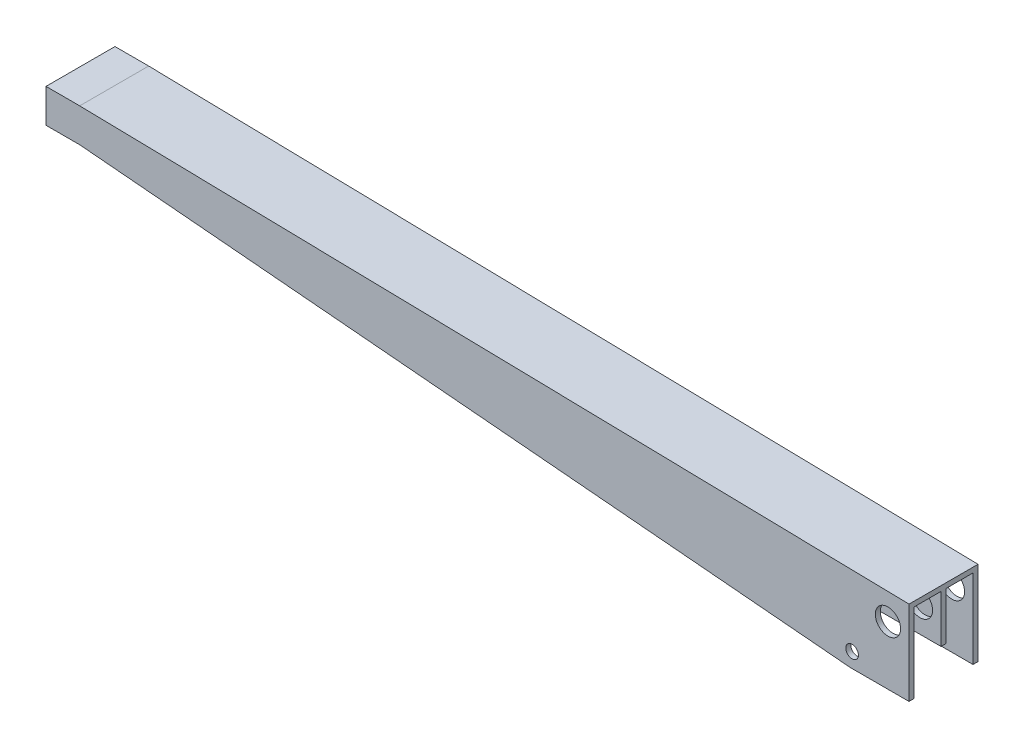
ISO-10303-21;
HEADER;
FILE_DESCRIPTION(('STEP AP214'),'2;1');
FILE_NAME('part.step','',(''),(''),'','','');
FILE_SCHEMA(('AUTOMOTIVE_DESIGN { 1 0 10303 214 1 1 1 1 }'));
ENDSEC;
DATA;
#1=APPLICATION_CONTEXT('core data for automotive mechanical design processes');
#2=APPLICATION_PROTOCOL_DEFINITION('international standard','automotive_design',2000,#1);
#3=PRODUCT_CONTEXT('',#1,'mechanical');
#4=PRODUCT('Part','Part','',(#3));
#5=PRODUCT_RELATED_PRODUCT_CATEGORY('part','',(#4));
#6=PRODUCT_DEFINITION_FORMATION('','',#4);
#7=PRODUCT_DEFINITION_CONTEXT('part definition',#1,'design');
#8=PRODUCT_DEFINITION('design','',#6,#7);
#9=PRODUCT_DEFINITION_SHAPE('','',#8);
#10=(LENGTH_UNIT() NAMED_UNIT(*) SI_UNIT(.MILLI.,.METRE.));
#11=(NAMED_UNIT(*) PLANE_ANGLE_UNIT() SI_UNIT($,.RADIAN.));
#12=(NAMED_UNIT(*) SI_UNIT($,.STERADIAN.) SOLID_ANGLE_UNIT());
#13=UNCERTAINTY_MEASURE_WITH_UNIT(LENGTH_MEASURE(1.E-05),#10,'distance_accuracy_value','');
#14=(GEOMETRIC_REPRESENTATION_CONTEXT(3) GLOBAL_UNCERTAINTY_ASSIGNED_CONTEXT((#13)) GLOBAL_UNIT_ASSIGNED_CONTEXT((#10,
#11,#12)) REPRESENTATION_CONTEXT('',''));
#15=CARTESIAN_POINT('',(0.,0.,0.));
#16=DIRECTION('',(0.,0.,1.));
#17=DIRECTION('',(1.,0.,0.));
#18=AXIS2_PLACEMENT_3D('',#15,#16,#17);
#19=CARTESIAN_POINT('',(-15.,239.301894781674,-2600.83256824123));
#20=DIRECTION('',(-0.0203288112779674,-0.999793348363563,0.));
#21=DIRECTION('',(0.999793348363563,-0.0203288112779674,0.));
#22=AXIS2_PLACEMENT_3D('',#19,#20,#21);
#23=PLANE('',#22);
#24=DIRECTION('',(0.,0.,1.));
#25=VECTOR('',#24,1.);
#26=CARTESIAN_POINT('',(0.,238.996899584748,-2600.83256824123));
#27=LINE('',#26,#25);
#28=CARTESIAN_POINT('',(0.,238.996899584748,0.));
#29=VERTEX_POINT('',#28);
#30=CARTESIAN_POINT('',(0.,238.996899584748,81.3999999999999));
#31=VERTEX_POINT('',#30);
#32=EDGE_CURVE('E270',#29,#31,#27,.T.);
#33=ORIENTED_EDGE('',*,*,#32,.T.);
#34=DIRECTION('',(-0.999793348363563,0.0203288112779674,0.));
#35=VECTOR('',#34,1.);
#36=CARTESIAN_POINT('',(-15.,239.301894781674,81.3999999999999));
#37=LINE('',#36,#35);
#38=CARTESIAN_POINT('',(-2498.5524818399,289.8,81.3999999999999));
#39=VERTEX_POINT('',#38);
#40=EDGE_CURVE('E228',#31,#39,#37,.T.);
#41=ORIENTED_EDGE('',*,*,#40,.T.);
#42=DIRECTION('',(0.,0.,1.));
#43=VECTOR('',#42,1.);
#44=CARTESIAN_POINT('',(-2498.5524818399,289.8,-2600.83256824123));
#45=LINE('',#44,#43);
#46=CARTESIAN_POINT('',(-2498.5524818399,289.8,0.));
#47=VERTEX_POINT('',#46);
#48=EDGE_CURVE('E288',#47,#39,#45,.T.);
#49=ORIENTED_EDGE('',*,*,#48,.F.);
#50=DIRECTION('',(-0.999793348363563,0.0203288112779674,0.));
#51=VECTOR('',#50,1.);
#52=CARTESIAN_POINT('',(-15.,239.301894781674,0.));
#53=LINE('',#52,#51);
#54=EDGE_CURVE('E269',#29,#47,#53,.T.);
#55=ORIENTED_EDGE('',*,*,#54,.F.);
#56=EDGE_LOOP('',(#33,#41,#49,#55));
#57=FACE_BOUND('',#56,.T.);
#58=ADVANCED_FACE('F36',(#57),#23,.T.);
#59=CARTESIAN_POINT('',(-2498.5524818399,289.8,-2600.83256824123));
#60=DIRECTION('',(0.,-1.,0.));
#61=DIRECTION('',(1.,0.,0.));
#62=AXIS2_PLACEMENT_3D('',#59,#60,#61);
#63=PLANE('',#62);
#64=ORIENTED_EDGE('',*,*,#48,.T.);
#65=DIRECTION('',(-1.,0.,0.));
#66=VECTOR('',#65,1.);
#67=CARTESIAN_POINT('',(-2498.5524818399,289.8,81.3999999999999));
#68=LINE('',#67,#66);
#69=CARTESIAN_POINT('',(-2600.,289.8,81.3999999999999));
#70=VERTEX_POINT('',#69);
#71=EDGE_CURVE('E226',#39,#70,#68,.T.);
#72=ORIENTED_EDGE('',*,*,#71,.T.);
#73=DIRECTION('',(0.,0.,1.));
#74=VECTOR('',#73,1.);
#75=CARTESIAN_POINT('',(-2600.,289.8,-2600.83256824123));
#76=LINE('',#75,#74);
#77=CARTESIAN_POINT('',(-2600.,289.8,0.));
#78=VERTEX_POINT('',#77);
#79=EDGE_CURVE('E292',#78,#70,#76,.T.);
#80=ORIENTED_EDGE('',*,*,#79,.F.);
#81=DIRECTION('',(-1.,0.,0.));
#82=VECTOR('',#81,1.);
#83=CARTESIAN_POINT('',(-2498.5524818399,289.8,0.));
#84=LINE('',#83,#82);
#85=EDGE_CURVE('E266',#47,#78,#84,.T.);
#86=ORIENTED_EDGE('',*,*,#85,.F.);
#87=EDGE_LOOP('',(#64,#72,#80,#86));
#88=FACE_BOUND('',#87,.T.);
#89=ADVANCED_FACE('F355',(#88),#63,.T.);
#90=DIRECTION('',(-0.999793348363563,0.0203288112779674,0.));
#91=VECTOR('',#90,1.);
#92=CARTESIAN_POINT('',(-15.,239.301894781674,96.4));
#93=LINE('',#92,#91);
#94=CARTESIAN_POINT('',(0.,238.996899584748,96.4));
#95=VERTEX_POINT('',#94);
#96=CARTESIAN_POINT('',(-2498.5524818399,289.8,96.4));
#97=VERTEX_POINT('',#96);
#98=EDGE_CURVE('E223',#95,#97,#93,.T.);
#99=ORIENTED_EDGE('',*,*,#98,.F.);
#100=CARTESIAN_POINT('',(0.,238.996899584748,177.8));
#101=VERTEX_POINT('',#100);
#102=EDGE_CURVE('E287',#95,#101,#27,.T.);
#103=ORIENTED_EDGE('',*,*,#102,.T.);
#104=DIRECTION('',(-0.999793348363563,0.0203288112779674,0.));
#105=VECTOR('',#104,1.);
#106=CARTESIAN_POINT('',(-15.,239.301894781674,177.8));
#107=LINE('',#106,#105);
#108=CARTESIAN_POINT('',(-2498.5524818399,289.8,177.8));
#109=VERTEX_POINT('',#108);
#110=EDGE_CURVE('E262',#101,#109,#107,.T.);
#111=ORIENTED_EDGE('',*,*,#110,.T.);
#112=EDGE_CURVE('E291',#97,#109,#45,.T.);
#113=ORIENTED_EDGE('',*,*,#112,.F.);
#114=EDGE_LOOP('',(#99,#103,#111,#113));
#115=FACE_BOUND('',#114,.T.);
#116=ADVANCED_FACE('F410',(#115),#23,.T.);
#117=DIRECTION('',(-1.,0.,0.));
#118=VECTOR('',#117,1.);
#119=CARTESIAN_POINT('',(-2498.5524818399,289.8,96.4));
#120=LINE('',#119,#118);
#121=CARTESIAN_POINT('',(-2600.,289.8,96.4));
#122=VERTEX_POINT('',#121);
#123=EDGE_CURVE('E60',#97,#122,#120,.T.);
#124=ORIENTED_EDGE('',*,*,#123,.F.);
#125=ORIENTED_EDGE('',*,*,#112,.T.);
#126=DIRECTION('',(-1.,0.,0.));
#127=VECTOR('',#126,1.);
#128=CARTESIAN_POINT('',(-2498.5524818399,289.8,177.8));
#129=LINE('',#128,#127);
#130=CARTESIAN_POINT('',(-2600.,289.8,177.8));
#131=VERTEX_POINT('',#130);
#132=EDGE_CURVE('E11',#109,#131,#129,.T.);
#133=ORIENTED_EDGE('',*,*,#132,.T.);
#134=EDGE_CURVE('E284',#122,#131,#76,.T.);
#135=ORIENTED_EDGE('',*,*,#134,.F.);
#136=EDGE_LOOP('',(#124,#125,#133,#135));
#137=FACE_BOUND('',#136,.T.);
#138=ADVANCED_FACE('F402',(#137),#63,.T.);
#139=CARTESIAN_POINT('',(0.,0.,0.));
#140=DIRECTION('',(0.,0.,1.));
#141=DIRECTION('',(1.,0.,0.));
#142=AXIS2_PLACEMENT_3D('',#139,#140,#141);
#143=PLANE('',#142);
#144=CARTESIAN_POINT('',(-171.45,44.45,0.));
#145=DIRECTION('',(0.,0.,1.));
#146=DIRECTION('',(1.,0.,0.));
#147=AXIS2_PLACEMENT_3D('',#144,#145,#146);
#148=CIRCLE('',#147,19.05);
#149=CARTESIAN_POINT('',(-152.4,44.45,0.));
#150=VERTEX_POINT('',#149);
#151=EDGE_CURVE('E381',#150,#150,#148,.T.);
#152=ORIENTED_EDGE('',*,*,#151,.F.);
#153=EDGE_LOOP('',(#152));
#154=FACE_BOUND('',#153,.T.);
#155=CARTESIAN_POINT('',(-63.5,176.782795881907,0.));
#156=DIRECTION('',(0.,0.,1.));
#157=DIRECTION('',(1.,0.,0.));
#158=AXIS2_PLACEMENT_3D('',#155,#156,#157);
#159=CIRCLE('',#158,38.1);
#160=CARTESIAN_POINT('',(-25.4,176.782795881907,0.));
#161=VERTEX_POINT('',#160);
#162=EDGE_CURVE('E204',#161,#161,#159,.T.);
#163=ORIENTED_EDGE('',*,*,#162,.F.);
#164=EDGE_LOOP('',(#163));
#165=FACE_BOUND('',#164,.T.);
#166=DIRECTION('',(0.,1.,0.));
#167=VECTOR('',#166,1.);
#168=CARTESIAN_POINT('',(0.,0.,0.));
#169=LINE('',#168,#167);
#170=CARTESIAN_POINT('',(0.,0.,0.));
#171=VERTEX_POINT('',#170);
#172=EDGE_CURVE('E299',#171,#29,#169,.T.);
#173=ORIENTED_EDGE('',*,*,#172,.T.);
#174=ORIENTED_EDGE('',*,*,#54,.T.);
#175=ORIENTED_EDGE('',*,*,#85,.T.);
#176=DIRECTION('',(0.,-1.,0.));
#177=VECTOR('',#176,1.);
#178=CARTESIAN_POINT('',(-2600.,304.8,0.));
#179=LINE('',#178,#177);
#180=CARTESIAN_POINT('',(-2600.,203.2,0.));
#181=VERTEX_POINT('',#180);
#182=EDGE_CURVE('E273',#78,#181,#179,.T.);
#183=ORIENTED_EDGE('',*,*,#182,.T.);
#184=DIRECTION('',(1.,0.,0.));
#185=VECTOR('',#184,1.);
#186=CARTESIAN_POINT('',(-2600.,203.2,0.));
#187=LINE('',#186,#185);
#188=CARTESIAN_POINT('',(-2498.4,203.2,0.));
#189=VERTEX_POINT('',#188);
#190=EDGE_CURVE('E319',#181,#189,#187,.T.);
#191=ORIENTED_EDGE('',*,*,#190,.T.);
#192=DIRECTION('',(0.996188217209835,-0.0872297878725495,0.));
#193=VECTOR('',#192,1.);
#194=CARTESIAN_POINT('',(-2498.4,203.2,0.));
#195=LINE('',#194,#193);
#196=CARTESIAN_POINT('',(-177.8,0.,0.));
#197=VERTEX_POINT('',#196);
#198=EDGE_CURVE('E322',#189,#197,#195,.T.);
#199=ORIENTED_EDGE('',*,*,#198,.T.);
#200=DIRECTION('',(1.,0.,0.));
#201=VECTOR('',#200,1.);
#202=CARTESIAN_POINT('',(-177.8,0.,0.));
#203=LINE('',#202,#201);
#204=EDGE_CURVE('E325',#197,#171,#203,.T.);
#205=ORIENTED_EDGE('',*,*,#204,.T.);
#206=EDGE_LOOP('',(#173,#174,#175,#183,#191,#199,#205));
#207=FACE_BOUND('',#206,.T.);
#208=ADVANCED_FACE('F352',(#154,#165,#207),#143,.T.);
#209=CARTESIAN_POINT('',(-2600.,304.8,-15.));
#210=DIRECTION('',(-1.,0.,0.));
#211=DIRECTION('',(0.,0.,1.));
#212=AXIS2_PLACEMENT_3D('',#209,#210,#211);
#213=PLANE('',#212);
#214=DIRECTION('',(0.,-1.,0.));
#215=VECTOR('',#214,1.);
#216=CARTESIAN_POINT('',(-2600.,289.8,192.8));
#217=LINE('',#216,#215);
#218=CARTESIAN_POINT('',(-2600.,304.8,192.8));
#219=VERTEX_POINT('',#218);
#220=CARTESIAN_POINT('',(-2600.,203.2,192.8));
#221=VERTEX_POINT('',#220);
#222=EDGE_CURVE('E276',#219,#221,#217,.T.);
#223=ORIENTED_EDGE('',*,*,#222,.F.);
#224=DIRECTION('',(0.,0.,1.));
#225=VECTOR('',#224,1.);
#226=CARTESIAN_POINT('',(-2600.,304.8,-15.));
#227=LINE('',#226,#225);
#228=CARTESIAN_POINT('',(-2600.,304.8,-15.));
#229=VERTEX_POINT('',#228);
#230=EDGE_CURVE('E45',#229,#219,#227,.T.);
#231=ORIENTED_EDGE('',*,*,#230,.F.);
#232=DIRECTION('',(0.,-1.,0.));
#233=VECTOR('',#232,1.);
#234=CARTESIAN_POINT('',(-2600.,304.8,-15.));
#235=LINE('',#234,#233);
#236=CARTESIAN_POINT('',(-2600.,203.2,-15.));
#237=VERTEX_POINT('',#236);
#238=EDGE_CURVE('E295',#229,#237,#235,.T.);
#239=ORIENTED_EDGE('',*,*,#238,.T.);
#240=DIRECTION('',(0.,0.,1.));
#241=VECTOR('',#240,1.);
#242=CARTESIAN_POINT('',(-2600.,203.2,-15.));
#243=LINE('',#242,#241);
#244=EDGE_CURVE('E317',#237,#181,#243,.T.);
#245=ORIENTED_EDGE('',*,*,#244,.T.);
#246=ORIENTED_EDGE('',*,*,#182,.F.);
#247=ORIENTED_EDGE('',*,*,#79,.T.);
#248=DIRECTION('',(0.,-1.,0.));
#249=VECTOR('',#248,1.);
#250=CARTESIAN_POINT('',(-2600.,304.8,81.4));
#251=LINE('',#250,#249);
#252=CARTESIAN_POINT('',(-2600.,203.2,81.4));
#253=VERTEX_POINT('',#252);
#254=EDGE_CURVE('E215',#70,#253,#251,.T.);
#255=ORIENTED_EDGE('',*,*,#254,.T.);
#256=DIRECTION('',(0.,0.,1.));
#257=VECTOR('',#256,1.);
#258=CARTESIAN_POINT('',(-2600.,203.2,81.4));
#259=LINE('',#258,#257);
#260=CARTESIAN_POINT('',(-2600.,203.2,96.4));
#261=VERTEX_POINT('',#260);
#262=EDGE_CURVE('E218',#253,#261,#259,.T.);
#263=ORIENTED_EDGE('',*,*,#262,.T.);
#264=DIRECTION('',(0.,-1.,0.));
#265=VECTOR('',#264,1.);
#266=CARTESIAN_POINT('',(-2600.,304.8,96.4));
#267=LINE('',#266,#265);
#268=EDGE_CURVE('E202',#122,#261,#267,.T.);
#269=ORIENTED_EDGE('',*,*,#268,.F.);
#270=ORIENTED_EDGE('',*,*,#134,.T.);
#271=DIRECTION('',(0.,-1.,0.));
#272=VECTOR('',#271,1.);
#273=CARTESIAN_POINT('',(-2600.,304.8,177.8));
#274=LINE('',#273,#272);
#275=CARTESIAN_POINT('',(-2600.,203.2,177.8));
#276=VERTEX_POINT('',#275);
#277=EDGE_CURVE('E235',#131,#276,#274,.T.);
#278=ORIENTED_EDGE('',*,*,#277,.T.);
#279=DIRECTION('',(0.,0.,-1.));
#280=VECTOR('',#279,1.);
#281=CARTESIAN_POINT('',(-2600.,203.2,192.8));
#282=LINE('',#281,#280);
#283=EDGE_CURVE('E240',#221,#276,#282,.T.);
#284=ORIENTED_EDGE('',*,*,#283,.F.);
#285=EDGE_LOOP('',(#223,#231,#239,#245,#246,#247,#255,#263,#269,#270,#278,#284));
#286=FACE_BOUND('',#285,.T.);
#287=ADVANCED_FACE('F38',(#286),#213,.T.);
#288=CARTESIAN_POINT('',(-2600.,304.8,-15.));
#289=DIRECTION('',(0.,1.,0.));
#290=DIRECTION('',(-1.,0.,0.));
#291=AXIS2_PLACEMENT_3D('',#288,#289,#290);
#292=PLANE('',#291);
#293=DIRECTION('',(-1.,0.,0.));
#294=VECTOR('',#293,1.);
#295=CARTESIAN_POINT('',(-2600.,304.8,192.8));
#296=LINE('',#295,#294);
#297=CARTESIAN_POINT('',(-2498.4,304.8,192.8));
#298=VERTEX_POINT('',#297);
#299=EDGE_CURVE('E265',#298,#219,#296,.T.);
#300=ORIENTED_EDGE('',*,*,#299,.F.);
#301=DIRECTION('',(0.,0.,1.));
#302=VECTOR('',#301,1.);
#303=CARTESIAN_POINT('',(-2498.4,304.8,-15.));
#304=LINE('',#303,#302);
#305=CARTESIAN_POINT('',(-2498.4,304.8,-15.));
#306=VERTEX_POINT('',#305);
#307=EDGE_CURVE('E331',#306,#298,#304,.T.);
#308=ORIENTED_EDGE('',*,*,#307,.F.);
#309=DIRECTION('',(-1.,0.,0.));
#310=VECTOR('',#309,1.);
#311=CARTESIAN_POINT('',(-2600.,304.8,-15.));
#312=LINE('',#311,#310);
#313=EDGE_CURVE('E314',#306,#229,#312,.T.);
#314=ORIENTED_EDGE('',*,*,#313,.T.);
#315=ORIENTED_EDGE('',*,*,#230,.T.);
#316=EDGE_LOOP('',(#300,#308,#314,#315));
#317=FACE_BOUND('',#316,.T.);
#318=ADVANCED_FACE('F409',(#317),#292,.T.);
#319=CARTESIAN_POINT('',(0.,254.,-15.));
#320=DIRECTION('',(0.0203288112779655,0.999793348363563,0.));
#321=DIRECTION('',(-0.999793348363563,0.0203288112779655,0.));
#322=AXIS2_PLACEMENT_3D('',#319,#320,#321);
#323=PLANE('',#322);
#324=DIRECTION('',(-0.999793348363563,0.0203288112779655,0.));
#325=VECTOR('',#324,1.);
#326=CARTESIAN_POINT('',(-2498.4,304.8,192.8));
#327=LINE('',#326,#325);
#328=CARTESIAN_POINT('',(0.,254.,192.8));
#329=VERTEX_POINT('',#328);
#330=EDGE_CURVE('E281',#329,#298,#327,.T.);
#331=ORIENTED_EDGE('',*,*,#330,.F.);
#332=DIRECTION('',(0.,0.,1.));
#333=VECTOR('',#332,1.);
#334=CARTESIAN_POINT('',(0.,254.,-15.));
#335=LINE('',#334,#333);
#336=CARTESIAN_POINT('',(0.,254.,-15.));
#337=VERTEX_POINT('',#336);
#338=EDGE_CURVE('E333',#337,#329,#335,.T.);
#339=ORIENTED_EDGE('',*,*,#338,.F.);
#340=DIRECTION('',(-0.999793348363563,0.0203288112779655,0.));
#341=VECTOR('',#340,1.);
#342=CARTESIAN_POINT('',(0.,254.,-15.));
#343=LINE('',#342,#341);
#344=EDGE_CURVE('E311',#337,#306,#343,.T.);
#345=ORIENTED_EDGE('',*,*,#344,.T.);
#346=ORIENTED_EDGE('',*,*,#307,.T.);
#347=EDGE_LOOP('',(#331,#339,#345,#346));
#348=FACE_BOUND('',#347,.T.);
#349=ADVANCED_FACE('F458',(#348),#323,.T.);
#350=CARTESIAN_POINT('',(0.,0.,-15.));
#351=DIRECTION('',(1.,0.,0.));
#352=DIRECTION('',(0.,0.,-1.));
#353=AXIS2_PLACEMENT_3D('',#350,#351,#352);
#354=PLANE('',#353);
#355=DIRECTION('',(0.,0.,1.));
#356=VECTOR('',#355,1.);
#357=CARTESIAN_POINT('',(0.,95.25,-1187.76053470456));
#358=LINE('',#357,#356);
#359=CARTESIAN_POINT('',(0.,95.25,81.3999999999999));
#360=VERTEX_POINT('',#359);
#361=CARTESIAN_POINT('',(0.,95.25,96.4));
#362=VERTEX_POINT('',#361);
#363=EDGE_CURVE('E52',#360,#362,#358,.T.);
#364=ORIENTED_EDGE('',*,*,#363,.F.);
#365=DIRECTION('',(0.,1.,0.));
#366=VECTOR('',#365,1.);
#367=CARTESIAN_POINT('',(0.,0.,81.4));
#368=LINE('',#367,#366);
#369=EDGE_CURVE('E213',#360,#31,#368,.T.);
#370=ORIENTED_EDGE('',*,*,#369,.T.);
#371=ORIENTED_EDGE('',*,*,#32,.F.);
#372=ORIENTED_EDGE('',*,*,#172,.F.);
#373=DIRECTION('',(0.,0.,1.));
#374=VECTOR('',#373,1.);
#375=CARTESIAN_POINT('',(0.,0.,-15.));
#376=LINE('',#375,#374);
#377=CARTESIAN_POINT('',(0.,0.,-15.));
#378=VERTEX_POINT('',#377);
#379=EDGE_CURVE('E335',#378,#171,#376,.T.);
#380=ORIENTED_EDGE('',*,*,#379,.F.);
#381=DIRECTION('',(0.,1.,0.));
#382=VECTOR('',#381,1.);
#383=CARTESIAN_POINT('',(0.,0.,-15.));
#384=LINE('',#383,#382);
#385=EDGE_CURVE('E308',#378,#337,#384,.T.);
#386=ORIENTED_EDGE('',*,*,#385,.T.);
#387=ORIENTED_EDGE('',*,*,#338,.T.);
#388=DIRECTION('',(0.,1.,0.));
#389=VECTOR('',#388,1.);
#390=CARTESIAN_POINT('',(0.,238.996899584748,192.8));
#391=LINE('',#390,#389);
#392=CARTESIAN_POINT('',(0.,0.,192.8));
#393=VERTEX_POINT('',#392);
#394=EDGE_CURVE('E278',#393,#329,#391,.T.);
#395=ORIENTED_EDGE('',*,*,#394,.F.);
#396=DIRECTION('',(0.,0.,-1.));
#397=VECTOR('',#396,1.);
#398=CARTESIAN_POINT('',(0.,0.,192.8));
#399=LINE('',#398,#397);
#400=CARTESIAN_POINT('',(0.,0.,177.8));
#401=VERTEX_POINT('',#400);
#402=EDGE_CURVE('E253',#393,#401,#399,.T.);
#403=ORIENTED_EDGE('',*,*,#402,.T.);
#404=DIRECTION('',(0.,1.,0.));
#405=VECTOR('',#404,1.);
#406=CARTESIAN_POINT('',(0.,0.,177.8));
#407=LINE('',#406,#405);
#408=EDGE_CURVE('E247',#401,#101,#407,.T.);
#409=ORIENTED_EDGE('',*,*,#408,.T.);
#410=ORIENTED_EDGE('',*,*,#102,.F.);
#411=DIRECTION('',(0.,1.,0.));
#412=VECTOR('',#411,1.);
#413=CARTESIAN_POINT('',(0.,0.,96.4));
#414=LINE('',#413,#412);
#415=EDGE_CURVE('E200',#362,#95,#414,.T.);
#416=ORIENTED_EDGE('',*,*,#415,.F.);
#417=EDGE_LOOP('',(#364,#370,#371,#372,#380,#386,#387,#395,#403,#409,#410,#416));
#418=FACE_BOUND('',#417,.T.);
#419=ADVANCED_FACE('F429',(#418),#354,.T.);
#420=CARTESIAN_POINT('',(-177.8,0.,-15.));
#421=DIRECTION('',(0.,-1.,0.));
#422=DIRECTION('',(0.,0.,-1.));
#423=AXIS2_PLACEMENT_3D('',#420,#421,#422);
#424=PLANE('',#423);
#425=ORIENTED_EDGE('',*,*,#204,.F.);
#426=DIRECTION('',(0.,0.,1.));
#427=VECTOR('',#426,1.);
#428=CARTESIAN_POINT('',(-177.8,0.,-15.));
#429=LINE('',#428,#427);
#430=CARTESIAN_POINT('',(-177.8,0.,-15.));
#431=VERTEX_POINT('',#430);
#432=EDGE_CURVE('E337',#431,#197,#429,.T.);
#433=ORIENTED_EDGE('',*,*,#432,.F.);
#434=DIRECTION('',(1.,0.,0.));
#435=VECTOR('',#434,1.);
#436=CARTESIAN_POINT('',(-177.8,0.,-15.));
#437=LINE('',#436,#435);
#438=EDGE_CURVE('E305',#431,#378,#437,.T.);
#439=ORIENTED_EDGE('',*,*,#438,.T.);
#440=ORIENTED_EDGE('',*,*,#379,.T.);
#441=EDGE_LOOP('',(#425,#433,#439,#440));
#442=FACE_BOUND('',#441,.T.);
#443=ADVANCED_FACE('F464',(#442),#424,.T.);
#444=CARTESIAN_POINT('',(-2498.4,203.2,-15.));
#445=DIRECTION('',(-0.0872297878725495,-0.996188217209835,0.));
#446=DIRECTION('',(0.996188217209835,-0.0872297878725495,0.));
#447=AXIS2_PLACEMENT_3D('',#444,#445,#446);
#448=PLANE('',#447);
#449=ORIENTED_EDGE('',*,*,#198,.F.);
#450=DIRECTION('',(0.,0.,1.));
#451=VECTOR('',#450,1.);
#452=CARTESIAN_POINT('',(-2498.4,203.2,-15.));
#453=LINE('',#452,#451);
#454=CARTESIAN_POINT('',(-2498.4,203.2,-15.));
#455=VERTEX_POINT('',#454);
#456=EDGE_CURVE('E339',#455,#189,#453,.T.);
#457=ORIENTED_EDGE('',*,*,#456,.F.);
#458=DIRECTION('',(0.996188217209835,-0.0872297878725495,0.));
#459=VECTOR('',#458,1.);
#460=CARTESIAN_POINT('',(-2498.4,203.2,-15.));
#461=LINE('',#460,#459);
#462=EDGE_CURVE('E302',#455,#431,#461,.T.);
#463=ORIENTED_EDGE('',*,*,#462,.T.);
#464=ORIENTED_EDGE('',*,*,#432,.T.);
#465=EDGE_LOOP('',(#449,#457,#463,#464));
#466=FACE_BOUND('',#465,.T.);
#467=ADVANCED_FACE('F466',(#466),#448,.T.);
#468=CARTESIAN_POINT('',(-2600.,203.2,-15.));
#469=DIRECTION('',(0.,-1.,0.));
#470=DIRECTION('',(0.,0.,-1.));
#471=AXIS2_PLACEMENT_3D('',#468,#469,#470);
#472=PLANE('',#471);
#473=ORIENTED_EDGE('',*,*,#190,.F.);
#474=ORIENTED_EDGE('',*,*,#244,.F.);
#475=DIRECTION('',(1.,0.,0.));
#476=VECTOR('',#475,1.);
#477=CARTESIAN_POINT('',(-2600.,203.2,-15.));
#478=LINE('',#477,#476);
#479=EDGE_CURVE('E298',#237,#455,#478,.T.);
#480=ORIENTED_EDGE('',*,*,#479,.T.);
#481=ORIENTED_EDGE('',*,*,#456,.T.);
#482=EDGE_LOOP('',(#473,#474,#480,#481));
#483=FACE_BOUND('',#482,.T.);
#484=ADVANCED_FACE('F349',(#483),#472,.T.);
#485=CARTESIAN_POINT('',(0.,0.,-15.));
#486=DIRECTION('',(0.,0.,1.));
#487=DIRECTION('',(1.,0.,0.));
#488=AXIS2_PLACEMENT_3D('',#485,#486,#487);
#489=PLANE('',#488);
#490=CARTESIAN_POINT('',(-171.45,44.45,-15.));
#491=DIRECTION('',(0.,0.,1.));
#492=DIRECTION('',(1.,0.,0.));
#493=AXIS2_PLACEMENT_3D('',#490,#491,#492);
#494=CIRCLE('',#493,19.05);
#495=CARTESIAN_POINT('',(-152.4,44.45,-15.));
#496=VERTEX_POINT('',#495);
#497=EDGE_CURVE('E372',#496,#496,#494,.T.);
#498=ORIENTED_EDGE('',*,*,#497,.T.);
#499=EDGE_LOOP('',(#498));
#500=FACE_BOUND('',#499,.T.);
#501=CARTESIAN_POINT('',(-63.5,176.782795881907,-15.));
#502=DIRECTION('',(0.,0.,1.));
#503=DIRECTION('',(1.,0.,0.));
#504=AXIS2_PLACEMENT_3D('',#501,#502,#503);
#505=CIRCLE('',#504,38.1);
#506=CARTESIAN_POINT('',(-25.4,176.782795881907,-15.));
#507=VERTEX_POINT('',#506);
#508=EDGE_CURVE('E385',#507,#507,#505,.T.);
#509=ORIENTED_EDGE('',*,*,#508,.T.);
#510=EDGE_LOOP('',(#509));
#511=FACE_BOUND('',#510,.T.);
#512=ORIENTED_EDGE('',*,*,#238,.F.);
#513=ORIENTED_EDGE('',*,*,#313,.F.);
#514=ORIENTED_EDGE('',*,*,#344,.F.);
#515=ORIENTED_EDGE('',*,*,#385,.F.);
#516=ORIENTED_EDGE('',*,*,#438,.F.);
#517=ORIENTED_EDGE('',*,*,#462,.F.);
#518=ORIENTED_EDGE('',*,*,#479,.F.);
#519=EDGE_LOOP('',(#512,#513,#514,#515,#516,#517,#518));
#520=FACE_BOUND('',#519,.T.);
#521=ADVANCED_FACE('F453',(#500,#511,#520),#489,.F.);
#522=CARTESIAN_POINT('',(0.,0.,192.8));
#523=DIRECTION('',(0.,0.,1.));
#524=DIRECTION('',(1.,0.,0.));
#525=AXIS2_PLACEMENT_3D('',#522,#523,#524);
#526=PLANE('',#525);
#527=CARTESIAN_POINT('',(-171.45,44.45,192.8));
#528=DIRECTION('',(0.,0.,1.));
#529=DIRECTION('',(1.,0.,0.));
#530=AXIS2_PLACEMENT_3D('',#527,#528,#529);
#531=CIRCLE('',#530,19.05);
#532=CARTESIAN_POINT('',(-152.4,44.45,192.8));
#533=VERTEX_POINT('',#532);
#534=EDGE_CURVE('E369',#533,#533,#531,.T.);
#535=ORIENTED_EDGE('',*,*,#534,.F.);
#536=EDGE_LOOP('',(#535));
#537=FACE_BOUND('',#536,.T.);
#538=CARTESIAN_POINT('',(-63.5,176.782795881907,192.8));
#539=DIRECTION('',(0.,0.,1.));
#540=DIRECTION('',(1.,0.,0.));
#541=AXIS2_PLACEMENT_3D('',#538,#539,#540);
#542=CIRCLE('',#541,38.1);
#543=CARTESIAN_POINT('',(-25.4,176.782795881907,192.8));
#544=VERTEX_POINT('',#543);
#545=EDGE_CURVE('E384',#544,#544,#542,.T.);
#546=ORIENTED_EDGE('',*,*,#545,.F.);
#547=EDGE_LOOP('',(#546));
#548=FACE_BOUND('',#547,.T.);
#549=DIRECTION('',(1.,0.,0.));
#550=VECTOR('',#549,1.);
#551=CARTESIAN_POINT('',(-177.8,0.,192.8));
#552=LINE('',#551,#550);
#553=CARTESIAN_POINT('',(-177.8,0.,192.8));
#554=VERTEX_POINT('',#553);
#555=EDGE_CURVE('E237',#554,#393,#552,.T.);
#556=ORIENTED_EDGE('',*,*,#555,.T.);
#557=ORIENTED_EDGE('',*,*,#394,.T.);
#558=ORIENTED_EDGE('',*,*,#330,.T.);
#559=ORIENTED_EDGE('',*,*,#299,.T.);
#560=ORIENTED_EDGE('',*,*,#222,.T.);
#561=DIRECTION('',(1.,0.,0.));
#562=VECTOR('',#561,1.);
#563=CARTESIAN_POINT('',(-2600.,203.2,192.8));
#564=LINE('',#563,#562);
#565=CARTESIAN_POINT('',(-2498.4,203.2,192.8));
#566=VERTEX_POINT('',#565);
#567=EDGE_CURVE('E231',#221,#566,#564,.T.);
#568=ORIENTED_EDGE('',*,*,#567,.T.);
#569=DIRECTION('',(0.996188217209835,-0.0872297878725495,0.));
#570=VECTOR('',#569,1.);
#571=CARTESIAN_POINT('',(-2498.4,203.2,192.8));
#572=LINE('',#571,#570);
#573=EDGE_CURVE('E234',#566,#554,#572,.T.);
#574=ORIENTED_EDGE('',*,*,#573,.T.);
#575=EDGE_LOOP('',(#556,#557,#558,#559,#560,#568,#574));
#576=FACE_BOUND('',#575,.T.);
#577=ADVANCED_FACE('F448',(#537,#548,#576),#526,.T.);
#578=CARTESIAN_POINT('',(-2600.,203.2,192.8));
#579=DIRECTION('',(0.,1.,0.));
#580=DIRECTION('',(0.,0.,1.));
#581=AXIS2_PLACEMENT_3D('',#578,#579,#580);
#582=PLANE('',#581);
#583=DIRECTION('',(1.,0.,0.));
#584=VECTOR('',#583,1.);
#585=CARTESIAN_POINT('',(-2600.,203.2,177.8));
#586=LINE('',#585,#584);
#587=CARTESIAN_POINT('',(-2498.4,203.2,177.8));
#588=VERTEX_POINT('',#587);
#589=EDGE_CURVE('E230',#276,#588,#586,.T.);
#590=ORIENTED_EDGE('',*,*,#589,.T.);
#591=DIRECTION('',(0.,0.,-1.));
#592=VECTOR('',#591,1.);
#593=CARTESIAN_POINT('',(-2498.4,203.2,192.8));
#594=LINE('',#593,#592);
#595=EDGE_CURVE('E259',#566,#588,#594,.T.);
#596=ORIENTED_EDGE('',*,*,#595,.F.);
#597=ORIENTED_EDGE('',*,*,#567,.F.);
#598=ORIENTED_EDGE('',*,*,#283,.T.);
#599=EDGE_LOOP('',(#590,#596,#597,#598));
#600=FACE_BOUND('',#599,.T.);
#601=ADVANCED_FACE('F441',(#600),#582,.F.);
#602=CARTESIAN_POINT('',(-2498.4,203.2,192.8));
#603=DIRECTION('',(0.0872297878725495,0.996188217209835,0.));
#604=DIRECTION('',(-0.996188217209835,0.0872297878725495,0.));
#605=AXIS2_PLACEMENT_3D('',#602,#603,#604);
#606=PLANE('',#605);
#607=DIRECTION('',(0.996188217209835,-0.0872297878725495,0.));
#608=VECTOR('',#607,1.);
#609=CARTESIAN_POINT('',(-2498.4,203.2,177.8));
#610=LINE('',#609,#608);
#611=CARTESIAN_POINT('',(-177.8,0.,177.8));
#612=VERTEX_POINT('',#611);
#613=EDGE_CURVE('E243',#588,#612,#610,.T.);
#614=ORIENTED_EDGE('',*,*,#613,.T.);
#615=DIRECTION('',(0.,0.,-1.));
#616=VECTOR('',#615,1.);
#617=CARTESIAN_POINT('',(-177.8,0.,192.8));
#618=LINE('',#617,#616);
#619=EDGE_CURVE('E256',#554,#612,#618,.T.);
#620=ORIENTED_EDGE('',*,*,#619,.F.);
#621=ORIENTED_EDGE('',*,*,#573,.F.);
#622=ORIENTED_EDGE('',*,*,#595,.T.);
#623=EDGE_LOOP('',(#614,#620,#621,#622));
#624=FACE_BOUND('',#623,.T.);
#625=ADVANCED_FACE('F445',(#624),#606,.F.);
#626=CARTESIAN_POINT('',(-177.8,0.,192.8));
#627=DIRECTION('',(0.,1.,0.));
#628=DIRECTION('',(0.,0.,1.));
#629=AXIS2_PLACEMENT_3D('',#626,#627,#628);
#630=PLANE('',#629);
#631=DIRECTION('',(1.,0.,0.));
#632=VECTOR('',#631,1.);
#633=CARTESIAN_POINT('',(-177.8,0.,177.8));
#634=LINE('',#633,#632);
#635=EDGE_CURVE('E245',#612,#401,#634,.T.);
#636=ORIENTED_EDGE('',*,*,#635,.T.);
#637=ORIENTED_EDGE('',*,*,#402,.F.);
#638=ORIENTED_EDGE('',*,*,#555,.F.);
#639=ORIENTED_EDGE('',*,*,#619,.T.);
#640=EDGE_LOOP('',(#636,#637,#638,#639));
#641=FACE_BOUND('',#640,.T.);
#642=ADVANCED_FACE('F530',(#641),#630,.F.);
#643=CARTESIAN_POINT('',(0.,0.,177.8));
#644=DIRECTION('',(0.,0.,1.));
#645=DIRECTION('',(1.,0.,0.));
#646=AXIS2_PLACEMENT_3D('',#643,#644,#645);
#647=PLANE('',#646);
#648=CARTESIAN_POINT('',(-171.45,44.45,177.8));
#649=DIRECTION('',(0.,0.,1.));
#650=DIRECTION('',(1.,0.,0.));
#651=AXIS2_PLACEMENT_3D('',#648,#649,#650);
#652=CIRCLE('',#651,19.05);
#653=CARTESIAN_POINT('',(-152.4,44.45,177.8));
#654=VERTEX_POINT('',#653);
#655=EDGE_CURVE('E377',#654,#654,#652,.T.);
#656=ORIENTED_EDGE('',*,*,#655,.T.);
#657=EDGE_LOOP('',(#656));
#658=FACE_BOUND('',#657,.T.);
#659=CARTESIAN_POINT('',(-63.5,176.782795881907,177.8));
#660=DIRECTION('',(0.,0.,1.));
#661=DIRECTION('',(1.,0.,0.));
#662=AXIS2_PLACEMENT_3D('',#659,#660,#661);
#663=CIRCLE('',#662,38.1);
#664=CARTESIAN_POINT('',(-25.4,176.782795881907,177.8));
#665=VERTEX_POINT('',#664);
#666=EDGE_CURVE('E393',#665,#665,#663,.T.);
#667=ORIENTED_EDGE('',*,*,#666,.T.);
#668=EDGE_LOOP('',(#667));
#669=FACE_BOUND('',#668,.T.);
#670=ORIENTED_EDGE('',*,*,#110,.F.);
#671=ORIENTED_EDGE('',*,*,#408,.F.);
#672=ORIENTED_EDGE('',*,*,#635,.F.);
#673=ORIENTED_EDGE('',*,*,#613,.F.);
#674=ORIENTED_EDGE('',*,*,#589,.F.);
#675=ORIENTED_EDGE('',*,*,#277,.F.);
#676=ORIENTED_EDGE('',*,*,#132,.F.);
#677=EDGE_LOOP('',(#670,#671,#672,#673,#674,#675,#676));
#678=FACE_BOUND('',#677,.T.);
#679=ADVANCED_FACE('F434',(#658,#669,#678),#647,.F.);
#680=CARTESIAN_POINT('',(-2600.,203.2,81.4));
#681=DIRECTION('',(0.,-1.,0.));
#682=DIRECTION('',(0.,0.,-1.));
#683=AXIS2_PLACEMENT_3D('',#680,#681,#682);
#684=PLANE('',#683);
#685=DIRECTION('',(0.,0.,1.));
#686=VECTOR('',#685,1.);
#687=CARTESIAN_POINT('',(-2498.4,203.2,81.4));
#688=LINE('',#687,#686);
#689=CARTESIAN_POINT('',(-2498.4,203.2,81.4));
#690=VERTEX_POINT('',#689);
#691=CARTESIAN_POINT('',(-2498.4,203.2,96.4));
#692=VERTEX_POINT('',#691);
#693=EDGE_CURVE('E217',#690,#692,#688,.T.);
#694=ORIENTED_EDGE('',*,*,#693,.T.);
#695=DIRECTION('',(1.,0.,0.));
#696=VECTOR('',#695,1.);
#697=CARTESIAN_POINT('',(-2600.,203.2,96.4));
#698=LINE('',#697,#696);
#699=EDGE_CURVE('E199',#261,#692,#698,.T.);
#700=ORIENTED_EDGE('',*,*,#699,.F.);
#701=ORIENTED_EDGE('',*,*,#262,.F.);
#702=DIRECTION('',(1.,0.,0.));
#703=VECTOR('',#702,1.);
#704=CARTESIAN_POINT('',(-2600.,203.2,81.4));
#705=LINE('',#704,#703);
#706=EDGE_CURVE('E209',#253,#690,#705,.T.);
#707=ORIENTED_EDGE('',*,*,#706,.T.);
#708=EDGE_LOOP('',(#694,#700,#701,#707));
#709=FACE_BOUND('',#708,.T.);
#710=ADVANCED_FACE('F368',(#709),#684,.T.);
#711=CARTESIAN_POINT('',(-2498.4,203.2,81.4));
#712=DIRECTION('',(-0.0872297878725495,-0.996188217209835,0.));
#713=DIRECTION('',(0.996188217209835,-0.0872297878725495,0.));
#714=AXIS2_PLACEMENT_3D('',#711,#712,#713);
#715=PLANE('',#714);
#716=DIRECTION('',(0.,0.,1.));
#717=VECTOR('',#716,1.);
#718=CARTESIAN_POINT('',(-1265.58125,95.25,-1187.76053470456));
#719=LINE('',#718,#717);
#720=CARTESIAN_POINT('',(-1265.58125,95.25,81.3999999999999));
#721=VERTEX_POINT('',#720);
#722=CARTESIAN_POINT('',(-1265.58125,95.25,96.4));
#723=VERTEX_POINT('',#722);
#724=EDGE_CURVE('E180',#721,#723,#719,.T.);
#725=ORIENTED_EDGE('',*,*,#724,.T.);
#726=DIRECTION('',(0.996188217209835,-0.0872297878725495,0.));
#727=VECTOR('',#726,1.);
#728=CARTESIAN_POINT('',(-2498.4,203.2,96.4));
#729=LINE('',#728,#727);
#730=EDGE_CURVE('E190',#692,#723,#729,.T.);
#731=ORIENTED_EDGE('',*,*,#730,.F.);
#732=ORIENTED_EDGE('',*,*,#693,.F.);
#733=DIRECTION('',(0.996188217209835,-0.0872297878725495,0.));
#734=VECTOR('',#733,1.);
#735=CARTESIAN_POINT('',(-2498.4,203.2,81.4));
#736=LINE('',#735,#734);
#737=EDGE_CURVE('E193',#690,#721,#736,.T.);
#738=ORIENTED_EDGE('',*,*,#737,.T.);
#739=EDGE_LOOP('',(#725,#731,#732,#738));
#740=FACE_BOUND('',#739,.T.);
#741=ADVANCED_FACE('F189',(#740),#715,.T.);
#742=CARTESIAN_POINT('',(0.,0.,81.4));
#743=DIRECTION('',(0.,0.,1.));
#744=DIRECTION('',(1.,0.,0.));
#745=AXIS2_PLACEMENT_3D('',#742,#743,#744);
#746=PLANE('',#745);
#747=CARTESIAN_POINT('',(-63.5,176.782795881907,81.4));
#748=DIRECTION('',(0.,0.,1.));
#749=DIRECTION('',(1.,0.,0.));
#750=AXIS2_PLACEMENT_3D('',#747,#748,#749);
#751=CIRCLE('',#750,38.1);
#752=CARTESIAN_POINT('',(-25.4,176.782795881907,81.4));
#753=VERTEX_POINT('',#752);
#754=EDGE_CURVE('E390',#753,#753,#751,.T.);
#755=ORIENTED_EDGE('',*,*,#754,.T.);
#756=EDGE_LOOP('',(#755));
#757=FACE_BOUND('',#756,.T.);
#758=ORIENTED_EDGE('',*,*,#369,.F.);
#759=DIRECTION('',(1.,0.,0.));
#760=VECTOR('',#759,1.);
#761=CARTESIAN_POINT('',(-1265.58125,95.25,81.3999999999999));
#762=LINE('',#761,#760);
#763=EDGE_CURVE('E194',#721,#360,#762,.T.);
#764=ORIENTED_EDGE('',*,*,#763,.F.);
#765=ORIENTED_EDGE('',*,*,#737,.F.);
#766=ORIENTED_EDGE('',*,*,#706,.F.);
#767=ORIENTED_EDGE('',*,*,#254,.F.);
#768=ORIENTED_EDGE('',*,*,#71,.F.);
#769=ORIENTED_EDGE('',*,*,#40,.F.);
#770=EDGE_LOOP('',(#758,#764,#765,#766,#767,#768,#769));
#771=FACE_BOUND('',#770,.T.);
#772=ADVANCED_FACE('F362',(#757,#771),#746,.F.);
#773=CARTESIAN_POINT('',(0.,0.,96.4));
#774=DIRECTION('',(0.,0.,1.));
#775=DIRECTION('',(1.,0.,0.));
#776=AXIS2_PLACEMENT_3D('',#773,#774,#775);
#777=PLANE('',#776);
#778=DIRECTION('',(-1.,0.,0.));
#779=VECTOR('',#778,1.);
#780=CARTESIAN_POINT('',(-1265.58125,95.25,96.4));
#781=LINE('',#780,#779);
#782=EDGE_CURVE('E177',#362,#723,#781,.T.);
#783=ORIENTED_EDGE('',*,*,#782,.F.);
#784=ORIENTED_EDGE('',*,*,#415,.T.);
#785=ORIENTED_EDGE('',*,*,#98,.T.);
#786=ORIENTED_EDGE('',*,*,#123,.T.);
#787=ORIENTED_EDGE('',*,*,#268,.T.);
#788=ORIENTED_EDGE('',*,*,#699,.T.);
#789=ORIENTED_EDGE('',*,*,#730,.T.);
#790=EDGE_LOOP('',(#783,#784,#785,#786,#787,#788,#789));
#791=FACE_BOUND('',#790,.T.);
#792=CARTESIAN_POINT('',(-63.5,176.782795881907,96.4));
#793=DIRECTION('',(0.,0.,1.));
#794=DIRECTION('',(1.,0.,0.));
#795=AXIS2_PLACEMENT_3D('',#792,#793,#794);
#796=CIRCLE('',#795,38.1);
#797=CARTESIAN_POINT('',(-25.4,176.782795881907,96.4));
#798=VERTEX_POINT('',#797);
#799=EDGE_CURVE('E40',#798,#798,#796,.T.);
#800=ORIENTED_EDGE('',*,*,#799,.F.);
#801=EDGE_LOOP('',(#800));
#802=FACE_BOUND('',#801,.T.);
#803=ADVANCED_FACE('F196',(#791,#802),#777,.T.);
#804=CARTESIAN_POINT('',(-63.5,176.782795881907,-15.));
#805=DIRECTION('',(0.,0.,1.));
#806=DIRECTION('',(1.,0.,0.));
#807=AXIS2_PLACEMENT_3D('',#804,#805,#806);
#808=CYLINDRICAL_SURFACE('',#807,38.1);
#809=ORIENTED_EDGE('',*,*,#799,.T.);
#810=EDGE_LOOP('',(#809));
#811=FACE_BOUND('',#810,.T.);
#812=ORIENTED_EDGE('',*,*,#754,.F.);
#813=EDGE_LOOP('',(#812));
#814=FACE_BOUND('',#813,.T.);
#815=ADVANCED_FACE('F608',(#811,#814),#808,.F.);
#816=ORIENTED_EDGE('',*,*,#545,.T.);
#817=EDGE_LOOP('',(#816));
#818=FACE_BOUND('',#817,.T.);
#819=ORIENTED_EDGE('',*,*,#666,.F.);
#820=EDGE_LOOP('',(#819));
#821=FACE_BOUND('',#820,.T.);
#822=ADVANCED_FACE('F617',(#818,#821),#808,.F.);
#823=ORIENTED_EDGE('',*,*,#162,.T.);
#824=EDGE_LOOP('',(#823));
#825=FACE_BOUND('',#824,.T.);
#826=ORIENTED_EDGE('',*,*,#508,.F.);
#827=EDGE_LOOP('',(#826));
#828=FACE_BOUND('',#827,.T.);
#829=ADVANCED_FACE('F398',(#825,#828),#808,.F.);
#830=CARTESIAN_POINT('',(-171.45,44.45,-15.));
#831=DIRECTION('',(0.,0.,1.));
#832=DIRECTION('',(1.,0.,0.));
#833=AXIS2_PLACEMENT_3D('',#830,#831,#832);
#834=CYLINDRICAL_SURFACE('',#833,19.05);
#835=ORIENTED_EDGE('',*,*,#534,.T.);
#836=EDGE_LOOP('',(#835));
#837=FACE_BOUND('',#836,.T.);
#838=ORIENTED_EDGE('',*,*,#655,.F.);
#839=EDGE_LOOP('',(#838));
#840=FACE_BOUND('',#839,.T.);
#841=ADVANCED_FACE('F634',(#837,#840),#834,.F.);
#842=ORIENTED_EDGE('',*,*,#151,.T.);
#843=EDGE_LOOP('',(#842));
#844=FACE_BOUND('',#843,.T.);
#845=ORIENTED_EDGE('',*,*,#497,.F.);
#846=EDGE_LOOP('',(#845));
#847=FACE_BOUND('',#846,.T.);
#848=ADVANCED_FACE('F641',(#844,#847),#834,.F.);
#849=CARTESIAN_POINT('',(-1265.58125,95.25,-1187.76053470456));
#850=DIRECTION('',(0.,1.,0.));
#851=DIRECTION('',(-1.,0.,0.));
#852=AXIS2_PLACEMENT_3D('',#849,#850,#851);
#853=PLANE('',#852);
#854=ORIENTED_EDGE('',*,*,#763,.T.);
#855=ORIENTED_EDGE('',*,*,#363,.T.);
#856=ORIENTED_EDGE('',*,*,#782,.T.);
#857=ORIENTED_EDGE('',*,*,#724,.F.);
#858=EDGE_LOOP('',(#854,#855,#856,#857));
#859=FACE_BOUND('',#858,.T.);
#860=ADVANCED_FACE('F179',(#859),#853,.F.);
#861=CLOSED_SHELL('',(#58,#89,#116,#138,#208,#287,#318,#349,#419,#443,#467,#484,#521,#577,#601,
#625,#642,#679,#710,#741,#772,#803,#815,#822,#829,#841,#848,#860));
#862=MANIFOLD_SOLID_BREP('B2',#861);
#863=ADVANCED_BREP_SHAPE_REPRESENTATION('',(#18,#862),#14);
#864=SHAPE_DEFINITION_REPRESENTATION(#9,#863);
ENDSEC;
END-ISO-10303-21;
